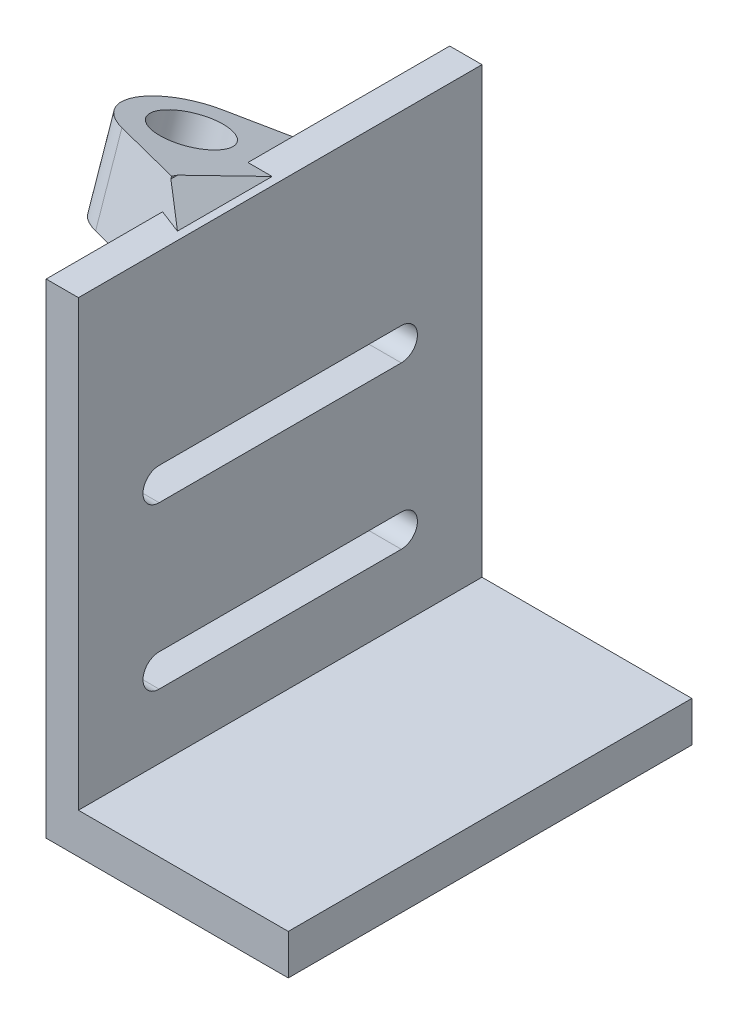
ISO-10303-21;
HEADER;
FILE_DESCRIPTION(('STEP AP214'),'2;1');
FILE_NAME('part.step','',(''),(''),'','','');
FILE_SCHEMA(('AUTOMOTIVE_DESIGN { 1 0 10303 214 1 1 1 1 }'));
ENDSEC;
DATA;
#1=APPLICATION_CONTEXT('core data for automotive mechanical design processes');
#2=APPLICATION_PROTOCOL_DEFINITION('international standard','automotive_design',2000,#1);
#3=PRODUCT_CONTEXT('',#1,'mechanical');
#4=PRODUCT('Part','Part','',(#3));
#5=PRODUCT_RELATED_PRODUCT_CATEGORY('part','',(#4));
#6=PRODUCT_DEFINITION_FORMATION('','',#4);
#7=PRODUCT_DEFINITION_CONTEXT('part definition',#1,'design');
#8=PRODUCT_DEFINITION('design','',#6,#7);
#9=PRODUCT_DEFINITION_SHAPE('','',#8);
#10=(LENGTH_UNIT() NAMED_UNIT(*) SI_UNIT(.MILLI.,.METRE.));
#11=(NAMED_UNIT(*) PLANE_ANGLE_UNIT() SI_UNIT($,.RADIAN.));
#12=(NAMED_UNIT(*) SI_UNIT($,.STERADIAN.) SOLID_ANGLE_UNIT());
#13=UNCERTAINTY_MEASURE_WITH_UNIT(LENGTH_MEASURE(1.E-05),#10,'distance_accuracy_value','');
#14=(GEOMETRIC_REPRESENTATION_CONTEXT(3) GLOBAL_UNCERTAINTY_ASSIGNED_CONTEXT((#13)) GLOBAL_UNIT_ASSIGNED_CONTEXT((#10,
#11,#12)) REPRESENTATION_CONTEXT('',''));
#15=CARTESIAN_POINT('',(0.,0.,0.));
#16=DIRECTION('',(0.,0.,1.));
#17=DIRECTION('',(1.,0.,0.));
#18=AXIS2_PLACEMENT_3D('',#15,#16,#17);
#19=CARTESIAN_POINT('',(0.,60.,50.));
#20=DIRECTION('',(1.,0.,0.));
#21=DIRECTION('',(0.,1.,0.));
#22=AXIS2_PLACEMENT_3D('',#19,#20,#21);
#23=PLANE('',#22);
#24=DIRECTION('',(0.,0.,1.));
#25=VECTOR('',#24,1.);
#26=CARTESIAN_POINT('',(0.,17.,50.));
#27=LINE('',#26,#25);
#28=CARTESIAN_POINT('',(0.,17.,10.));
#29=VERTEX_POINT('',#28);
#30=CARTESIAN_POINT('',(0.,17.,40.));
#31=VERTEX_POINT('',#30);
#32=EDGE_CURVE('E292',#29,#31,#27,.T.);
#33=ORIENTED_EDGE('',*,*,#32,.T.);
#34=CARTESIAN_POINT('',(0.,15.,40.));
#35=DIRECTION('',(1.,0.,0.));
#36=DIRECTION('',(0.,1.,0.));
#37=AXIS2_PLACEMENT_3D('',#34,#35,#36);
#38=CIRCLE('',#37,2.00000000000001);
#39=CARTESIAN_POINT('',(0.,13.,40.));
#40=VERTEX_POINT('',#39);
#41=EDGE_CURVE('E295',#31,#40,#38,.T.);
#42=ORIENTED_EDGE('',*,*,#41,.T.);
#43=DIRECTION('',(0.,0.,-1.));
#44=VECTOR('',#43,1.);
#45=CARTESIAN_POINT('',(0.,13.,50.));
#46=LINE('',#45,#44);
#47=CARTESIAN_POINT('',(0.,13.,10.));
#48=VERTEX_POINT('',#47);
#49=EDGE_CURVE('E280',#40,#48,#46,.T.);
#50=ORIENTED_EDGE('',*,*,#49,.T.);
#51=CARTESIAN_POINT('',(0.,15.,10.));
#52=DIRECTION('',(1.,0.,0.));
#53=DIRECTION('',(0.,1.,0.));
#54=AXIS2_PLACEMENT_3D('',#51,#52,#53);
#55=CIRCLE('',#54,2.00000000000001);
#56=EDGE_CURVE('E289',#48,#29,#55,.T.);
#57=ORIENTED_EDGE('',*,*,#56,.T.);
#58=EDGE_LOOP('',(#33,#42,#50,#57));
#59=FACE_BOUND('',#58,.T.);
#60=DIRECTION('',(0.,0.,1.));
#61=VECTOR('',#60,1.);
#62=CARTESIAN_POINT('',(0.,37.,50.));
#63=LINE('',#62,#61);
#64=CARTESIAN_POINT('',(0.,37.,10.));
#65=VERTEX_POINT('',#64);
#66=CARTESIAN_POINT('',(0.,37.,40.));
#67=VERTEX_POINT('',#66);
#68=EDGE_CURVE('E324',#65,#67,#63,.T.);
#69=ORIENTED_EDGE('',*,*,#68,.T.);
#70=CARTESIAN_POINT('',(0.,35.,40.));
#71=DIRECTION('',(1.,0.,0.));
#72=DIRECTION('',(0.,1.,0.));
#73=AXIS2_PLACEMENT_3D('',#70,#71,#72);
#74=CIRCLE('',#73,2.00000000000002);
#75=CARTESIAN_POINT('',(0.,33.,40.));
#76=VERTEX_POINT('',#75);
#77=EDGE_CURVE('E327',#67,#76,#74,.T.);
#78=ORIENTED_EDGE('',*,*,#77,.T.);
#79=DIRECTION('',(0.,0.,-1.));
#80=VECTOR('',#79,1.);
#81=CARTESIAN_POINT('',(0.,33.,50.));
#82=LINE('',#81,#80);
#83=CARTESIAN_POINT('',(0.,33.,10.));
#84=VERTEX_POINT('',#83);
#85=EDGE_CURVE('E312',#76,#84,#82,.T.);
#86=ORIENTED_EDGE('',*,*,#85,.T.);
#87=CARTESIAN_POINT('',(0.,35.,10.));
#88=DIRECTION('',(1.,0.,0.));
#89=DIRECTION('',(0.,1.,0.));
#90=AXIS2_PLACEMENT_3D('',#87,#88,#89);
#91=CIRCLE('',#90,2.00000000000002);
#92=EDGE_CURVE('E321',#84,#65,#91,.T.);
#93=ORIENTED_EDGE('',*,*,#92,.T.);
#94=EDGE_LOOP('',(#69,#78,#86,#93));
#95=FACE_BOUND('',#94,.T.);
#96=DIRECTION('',(0.,-0.945518575599318,0.325568154457154));
#97=VECTOR('',#96,1.);
#98=CARTESIAN_POINT('',(0.,56.7443184554284,15.5448142440068));
#99=LINE('',#98,#97);
#100=CARTESIAN_POINT('',(0.,56.7443184554285,15.5448142440068));
#101=VERTEX_POINT('',#100);
#102=CARTESIAN_POINT('',(0.,47.2891326994353,18.8004957885784));
#103=VERTEX_POINT('',#102);
#104=EDGE_CURVE('E223',#101,#103,#99,.T.);
#105=ORIENTED_EDGE('',*,*,#104,.F.);
#106=DIRECTION('',(0.,0.325568154457154,0.945518575599318));
#107=VECTOR('',#106,1.);
#108=CARTESIAN_POINT('',(0.,63.2556815445715,34.4551857559932));
#109=LINE('',#108,#107);
#110=CARTESIAN_POINT('',(0.,60.,25.));
#111=VERTEX_POINT('',#110);
#112=EDGE_CURVE('E179',#101,#111,#109,.T.);
#113=ORIENTED_EDGE('',*,*,#112,.T.);
#114=DIRECTION('',(0.,0.,-1.));
#115=VECTOR('',#114,1.);
#116=CARTESIAN_POINT('',(0.,60.,50.));
#117=LINE('',#116,#115);
#118=CARTESIAN_POINT('',(0.,60.,0.));
#119=VERTEX_POINT('',#118);
#120=EDGE_CURVE('E253',#111,#119,#117,.T.);
#121=ORIENTED_EDGE('',*,*,#120,.T.);
#122=DIRECTION('',(0.,-1.,0.));
#123=VECTOR('',#122,1.);
#124=CARTESIAN_POINT('',(0.,60.,0.));
#125=LINE('',#124,#123);
#126=CARTESIAN_POINT('',(0.,0.,0.));
#127=VERTEX_POINT('',#126);
#128=EDGE_CURVE('E330',#119,#127,#125,.T.);
#129=ORIENTED_EDGE('',*,*,#128,.T.);
#130=DIRECTION('',(0.,0.,-1.));
#131=VECTOR('',#130,1.);
#132=CARTESIAN_POINT('',(0.,0.,50.));
#133=LINE('',#132,#131);
#134=CARTESIAN_POINT('',(0.,0.,50.));
#135=VERTEX_POINT('',#134);
#136=EDGE_CURVE('E370',#135,#127,#133,.T.);
#137=ORIENTED_EDGE('',*,*,#136,.F.);
#138=DIRECTION('',(0.,-1.,0.));
#139=VECTOR('',#138,1.);
#140=CARTESIAN_POINT('',(0.,60.,50.));
#141=LINE('',#140,#139);
#142=CARTESIAN_POINT('',(0.,60.,50.));
#143=VERTEX_POINT('',#142);
#144=EDGE_CURVE('E331',#143,#135,#141,.T.);
#145=ORIENTED_EDGE('',*,*,#144,.F.);
#146=CARTESIAN_POINT('',(0.,60.,35.5762068118667));
#147=VERTEX_POINT('',#146);
#148=EDGE_CURVE('E356',#143,#147,#117,.T.);
#149=ORIENTED_EDGE('',*,*,#148,.T.);
#150=DIRECTION('',(0.,-0.945518575599318,0.325568154457154));
#151=VECTOR('',#150,1.);
#152=CARTESIAN_POINT('',(0.,63.2556815445715,34.4551857559932));
#153=LINE('',#152,#151);
#154=CARTESIAN_POINT('',(0.,53.8004957885784,37.7108673005647));
#155=VERTEX_POINT('',#154);
#156=EDGE_CURVE('E237',#147,#155,#153,.T.);
#157=ORIENTED_EDGE('',*,*,#156,.T.);
#158=DIRECTION('',(0.,0.325568154457154,0.945518575599318));
#159=VECTOR('',#158,1.);
#160=CARTESIAN_POINT('',(0.,53.8004957885784,37.7108673005647));
#161=LINE('',#160,#159);
#162=EDGE_CURVE('E226',#103,#155,#161,.T.);
#163=ORIENTED_EDGE('',*,*,#162,.F.);
#164=EDGE_LOOP('',(#105,#113,#121,#129,#137,#145,#149,#157,#163));
#165=FACE_BOUND('',#164,.T.);
#166=ADVANCED_FACE('F34',(#59,#95,#165),#23,.F.);
#167=CARTESIAN_POINT('',(0.,0.,50.));
#168=DIRECTION('',(0.,1.,0.));
#169=DIRECTION('',(0.,0.,1.));
#170=AXIS2_PLACEMENT_3D('',#167,#168,#169);
#171=PLANE('',#170);
#172=DIRECTION('',(1.,0.,0.));
#173=VECTOR('',#172,1.);
#174=CARTESIAN_POINT('',(0.,0.,0.));
#175=LINE('',#174,#173);
#176=CARTESIAN_POINT('',(30.,0.,0.));
#177=VERTEX_POINT('',#176);
#178=EDGE_CURVE('E347',#127,#177,#175,.T.);
#179=ORIENTED_EDGE('',*,*,#178,.T.);
#180=DIRECTION('',(0.,0.,-1.));
#181=VECTOR('',#180,1.);
#182=CARTESIAN_POINT('',(30.,0.,50.));
#183=LINE('',#182,#181);
#184=CARTESIAN_POINT('',(30.,0.,50.));
#185=VERTEX_POINT('',#184);
#186=EDGE_CURVE('E368',#185,#177,#183,.T.);
#187=ORIENTED_EDGE('',*,*,#186,.F.);
#188=DIRECTION('',(1.,0.,0.));
#189=VECTOR('',#188,1.);
#190=CARTESIAN_POINT('',(0.,0.,50.));
#191=LINE('',#190,#189);
#192=EDGE_CURVE('E334',#135,#185,#191,.T.);
#193=ORIENTED_EDGE('',*,*,#192,.F.);
#194=ORIENTED_EDGE('',*,*,#136,.T.);
#195=EDGE_LOOP('',(#179,#187,#193,#194));
#196=FACE_BOUND('',#195,.T.);
#197=ADVANCED_FACE('F412',(#196),#171,.F.);
#198=CARTESIAN_POINT('',(30.,0.,50.));
#199=DIRECTION('',(-1.,0.,0.));
#200=DIRECTION('',(0.,0.,1.));
#201=AXIS2_PLACEMENT_3D('',#198,#199,#200);
#202=PLANE('',#201);
#203=DIRECTION('',(0.,1.,0.));
#204=VECTOR('',#203,1.);
#205=CARTESIAN_POINT('',(30.,0.,0.));
#206=LINE('',#205,#204);
#207=CARTESIAN_POINT('',(30.,5.,0.));
#208=VERTEX_POINT('',#207);
#209=EDGE_CURVE('E349',#177,#208,#206,.T.);
#210=ORIENTED_EDGE('',*,*,#209,.T.);
#211=DIRECTION('',(0.,0.,-1.));
#212=VECTOR('',#211,1.);
#213=CARTESIAN_POINT('',(30.,5.,50.));
#214=LINE('',#213,#212);
#215=CARTESIAN_POINT('',(30.,5.,50.));
#216=VERTEX_POINT('',#215);
#217=EDGE_CURVE('E365',#216,#208,#214,.T.);
#218=ORIENTED_EDGE('',*,*,#217,.F.);
#219=DIRECTION('',(0.,1.,0.));
#220=VECTOR('',#219,1.);
#221=CARTESIAN_POINT('',(30.,0.,50.));
#222=LINE('',#221,#220);
#223=EDGE_CURVE('E337',#185,#216,#222,.T.);
#224=ORIENTED_EDGE('',*,*,#223,.F.);
#225=ORIENTED_EDGE('',*,*,#186,.T.);
#226=EDGE_LOOP('',(#210,#218,#224,#225));
#227=FACE_BOUND('',#226,.T.);
#228=ADVANCED_FACE('F417',(#227),#202,.F.);
#229=CARTESIAN_POINT('',(30.,5.,50.));
#230=DIRECTION('',(0.,-1.,0.));
#231=DIRECTION('',(1.,0.,0.));
#232=AXIS2_PLACEMENT_3D('',#229,#230,#231);
#233=PLANE('',#232);
#234=DIRECTION('',(-1.,0.,0.));
#235=VECTOR('',#234,1.);
#236=CARTESIAN_POINT('',(30.,5.,0.));
#237=LINE('',#236,#235);
#238=CARTESIAN_POINT('',(4.,5.,0.));
#239=VERTEX_POINT('',#238);
#240=EDGE_CURVE('E351',#208,#239,#237,.T.);
#241=ORIENTED_EDGE('',*,*,#240,.T.);
#242=DIRECTION('',(0.,0.,-1.));
#243=VECTOR('',#242,1.);
#244=CARTESIAN_POINT('',(4.,5.,50.));
#245=LINE('',#244,#243);
#246=CARTESIAN_POINT('',(4.,5.,50.));
#247=VERTEX_POINT('',#246);
#248=EDGE_CURVE('E362',#247,#239,#245,.T.);
#249=ORIENTED_EDGE('',*,*,#248,.F.);
#250=DIRECTION('',(-1.,0.,0.));
#251=VECTOR('',#250,1.);
#252=CARTESIAN_POINT('',(30.,5.,50.));
#253=LINE('',#252,#251);
#254=EDGE_CURVE('E339',#216,#247,#253,.T.);
#255=ORIENTED_EDGE('',*,*,#254,.F.);
#256=ORIENTED_EDGE('',*,*,#217,.T.);
#257=EDGE_LOOP('',(#241,#249,#255,#256));
#258=FACE_BOUND('',#257,.T.);
#259=ADVANCED_FACE('F423',(#258),#233,.F.);
#260=CARTESIAN_POINT('',(4.,5.,50.));
#261=DIRECTION('',(-1.,0.,0.));
#262=DIRECTION('',(0.,-1.,0.));
#263=AXIS2_PLACEMENT_3D('',#260,#261,#262);
#264=PLANE('',#263);
#265=DIRECTION('',(0.,0.,-1.));
#266=VECTOR('',#265,1.);
#267=CARTESIAN_POINT('',(4.,13.,40.));
#268=LINE('',#267,#266);
#269=CARTESIAN_POINT('',(4.,13.,40.));
#270=VERTEX_POINT('',#269);
#271=CARTESIAN_POINT('',(4.,13.,10.));
#272=VERTEX_POINT('',#271);
#273=EDGE_CURVE('E199',#270,#272,#268,.T.);
#274=ORIENTED_EDGE('',*,*,#273,.F.);
#275=CARTESIAN_POINT('',(4.,15.,40.));
#276=DIRECTION('',(1.,0.,0.));
#277=DIRECTION('',(0.,1.,0.));
#278=AXIS2_PLACEMENT_3D('',#275,#276,#277);
#279=CIRCLE('',#278,2.00000000000001);
#280=CARTESIAN_POINT('',(4.,17.,40.));
#281=VERTEX_POINT('',#280);
#282=EDGE_CURVE('E197',#281,#270,#279,.T.);
#283=ORIENTED_EDGE('',*,*,#282,.F.);
#284=DIRECTION('',(0.,0.,1.));
#285=VECTOR('',#284,1.);
#286=CARTESIAN_POINT('',(4.,17.,40.));
#287=LINE('',#286,#285);
#288=CARTESIAN_POINT('',(4.,17.,10.));
#289=VERTEX_POINT('',#288);
#290=EDGE_CURVE('E274',#289,#281,#287,.T.);
#291=ORIENTED_EDGE('',*,*,#290,.F.);
#292=CARTESIAN_POINT('',(4.,15.,10.));
#293=DIRECTION('',(1.,0.,0.));
#294=DIRECTION('',(0.,1.,0.));
#295=AXIS2_PLACEMENT_3D('',#292,#293,#294);
#296=CIRCLE('',#295,2.00000000000001);
#297=EDGE_CURVE('E271',#272,#289,#296,.T.);
#298=ORIENTED_EDGE('',*,*,#297,.F.);
#299=EDGE_LOOP('',(#274,#283,#291,#298));
#300=FACE_BOUND('',#299,.T.);
#301=DIRECTION('',(0.,0.,-1.));
#302=VECTOR('',#301,1.);
#303=CARTESIAN_POINT('',(4.,33.,40.));
#304=LINE('',#303,#302);
#305=CARTESIAN_POINT('',(4.,33.,40.));
#306=VERTEX_POINT('',#305);
#307=CARTESIAN_POINT('',(4.,33.,10.));
#308=VERTEX_POINT('',#307);
#309=EDGE_CURVE('E300',#306,#308,#304,.T.);
#310=ORIENTED_EDGE('',*,*,#309,.F.);
#311=CARTESIAN_POINT('',(4.,35.,40.));
#312=DIRECTION('',(1.,0.,0.));
#313=DIRECTION('',(0.,1.,0.));
#314=AXIS2_PLACEMENT_3D('',#311,#312,#313);
#315=CIRCLE('',#314,2.00000000000002);
#316=CARTESIAN_POINT('',(4.,37.,40.));
#317=VERTEX_POINT('',#316);
#318=EDGE_CURVE('E298',#317,#306,#315,.T.);
#319=ORIENTED_EDGE('',*,*,#318,.F.);
#320=DIRECTION('',(0.,0.,1.));
#321=VECTOR('',#320,1.);
#322=CARTESIAN_POINT('',(4.,37.,40.));
#323=LINE('',#322,#321);
#324=CARTESIAN_POINT('',(4.,37.,10.));
#325=VERTEX_POINT('',#324);
#326=EDGE_CURVE('E306',#325,#317,#323,.T.);
#327=ORIENTED_EDGE('',*,*,#326,.F.);
#328=CARTESIAN_POINT('',(4.,35.,10.));
#329=DIRECTION('',(1.,0.,0.));
#330=DIRECTION('',(0.,1.,0.));
#331=AXIS2_PLACEMENT_3D('',#328,#329,#330);
#332=CIRCLE('',#331,2.00000000000002);
#333=EDGE_CURVE('E303',#308,#325,#332,.T.);
#334=ORIENTED_EDGE('',*,*,#333,.F.);
#335=EDGE_LOOP('',(#310,#319,#327,#334));
#336=FACE_BOUND('',#335,.T.);
#337=DIRECTION('',(0.,1.,0.));
#338=VECTOR('',#337,1.);
#339=CARTESIAN_POINT('',(4.,5.,0.));
#340=LINE('',#339,#338);
#341=CARTESIAN_POINT('',(4.,60.,0.));
#342=VERTEX_POINT('',#341);
#343=EDGE_CURVE('E353',#239,#342,#340,.T.);
#344=ORIENTED_EDGE('',*,*,#343,.T.);
#345=DIRECTION('',(0.,0.,-1.));
#346=VECTOR('',#345,1.);
#347=CARTESIAN_POINT('',(4.,60.,50.));
#348=LINE('',#347,#346);
#349=CARTESIAN_POINT('',(4.,60.,50.));
#350=VERTEX_POINT('',#349);
#351=EDGE_CURVE('E359',#350,#342,#348,.T.);
#352=ORIENTED_EDGE('',*,*,#351,.F.);
#353=DIRECTION('',(0.,1.,0.));
#354=VECTOR('',#353,1.);
#355=CARTESIAN_POINT('',(4.,5.,50.));
#356=LINE('',#355,#354);
#357=EDGE_CURVE('E341',#247,#350,#356,.T.);
#358=ORIENTED_EDGE('',*,*,#357,.F.);
#359=ORIENTED_EDGE('',*,*,#248,.T.);
#360=EDGE_LOOP('',(#344,#352,#358,#359));
#361=FACE_BOUND('',#360,.T.);
#362=ADVANCED_FACE('F427',(#300,#336,#361),#264,.F.);
#363=CARTESIAN_POINT('',(4.,60.,50.));
#364=DIRECTION('',(0.,-1.,0.));
#365=DIRECTION('',(0.,0.,-1.));
#366=AXIS2_PLACEMENT_3D('',#363,#364,#365);
#367=PLANE('',#366);
#368=ORIENTED_EDGE('',*,*,#120,.F.);
#369=DIRECTION('',(1.,0.,0.));
#370=VECTOR('',#369,1.);
#371=CARTESIAN_POINT('',(-1.38535694471102E-13,60.,25.0000000000001));
#372=LINE('',#371,#370);
#373=CARTESIAN_POINT('',(3.00000000000002,60.,25.0000000000001));
#374=VERTEX_POINT('',#373);
#375=EDGE_CURVE('E49',#111,#374,#372,.T.);
#376=ORIENTED_EDGE('',*,*,#375,.T.);
#377=DIRECTION('',(0.,0.,1.));
#378=VECTOR('',#377,1.);
#379=CARTESIAN_POINT('',(3.00000000000002,60.,50.));
#380=LINE('',#379,#378);
#381=CARTESIAN_POINT('',(3.00000000000002,60.,36.732035127735));
#382=VERTEX_POINT('',#381);
#383=EDGE_CURVE('E245',#374,#382,#380,.T.);
#384=ORIENTED_EDGE('',*,*,#383,.T.);
#385=DIRECTION('',(-0.933138877598145,0.,-0.359516112455163));
#386=VECTOR('',#385,1.);
#387=CARTESIAN_POINT('',(8.32186460952331,60.,38.7824223973698));
#388=LINE('',#387,#386);
#389=EDGE_CURVE('E243',#382,#147,#388,.T.);
#390=ORIENTED_EDGE('',*,*,#389,.T.);
#391=ORIENTED_EDGE('',*,*,#148,.F.);
#392=DIRECTION('',(-1.,0.,0.));
#393=VECTOR('',#392,1.);
#394=CARTESIAN_POINT('',(4.,60.,50.));
#395=LINE('',#394,#393);
#396=EDGE_CURVE('E343',#350,#143,#395,.T.);
#397=ORIENTED_EDGE('',*,*,#396,.F.);
#398=ORIENTED_EDGE('',*,*,#351,.T.);
#399=DIRECTION('',(-1.,0.,0.));
#400=VECTOR('',#399,1.);
#401=CARTESIAN_POINT('',(4.,60.,0.));
#402=LINE('',#401,#400);
#403=EDGE_CURVE('E335',#342,#119,#402,.T.);
#404=ORIENTED_EDGE('',*,*,#403,.T.);
#405=EDGE_LOOP('',(#368,#376,#384,#390,#391,#397,#398,#404));
#406=FACE_BOUND('',#405,.T.);
#407=ADVANCED_FACE('F250',(#406),#367,.F.);
#408=CARTESIAN_POINT('',(0.,0.,50.));
#409=DIRECTION('',(0.,0.,1.));
#410=DIRECTION('',(1.,0.,0.));
#411=AXIS2_PLACEMENT_3D('',#408,#409,#410);
#412=PLANE('',#411);
#413=ORIENTED_EDGE('',*,*,#144,.T.);
#414=ORIENTED_EDGE('',*,*,#192,.T.);
#415=ORIENTED_EDGE('',*,*,#223,.T.);
#416=ORIENTED_EDGE('',*,*,#254,.T.);
#417=ORIENTED_EDGE('',*,*,#357,.T.);
#418=ORIENTED_EDGE('',*,*,#396,.T.);
#419=EDGE_LOOP('',(#413,#414,#415,#416,#417,#418));
#420=FACE_BOUND('',#419,.T.);
#421=ADVANCED_FACE('F434',(#420),#412,.T.);
#422=CARTESIAN_POINT('',(0.,0.,0.));
#423=DIRECTION('',(0.,0.,1.));
#424=DIRECTION('',(1.,0.,0.));
#425=AXIS2_PLACEMENT_3D('',#422,#423,#424);
#426=PLANE('',#425);
#427=ORIENTED_EDGE('',*,*,#128,.F.);
#428=ORIENTED_EDGE('',*,*,#403,.F.);
#429=ORIENTED_EDGE('',*,*,#343,.F.);
#430=ORIENTED_EDGE('',*,*,#240,.F.);
#431=ORIENTED_EDGE('',*,*,#209,.F.);
#432=ORIENTED_EDGE('',*,*,#178,.F.);
#433=EDGE_LOOP('',(#427,#428,#429,#430,#431,#432));
#434=FACE_BOUND('',#433,.T.);
#435=ADVANCED_FACE('F435',(#434),#426,.F.);
#436=CARTESIAN_POINT('',(-46.,35.,40.));
#437=DIRECTION('',(1.,0.,0.));
#438=DIRECTION('',(0.,1.,0.));
#439=AXIS2_PLACEMENT_3D('',#436,#437,#438);
#440=CYLINDRICAL_SURFACE('',#439,2.00000000000002);
#441=DIRECTION('',(1.,0.,0.));
#442=VECTOR('',#441,1.);
#443=CARTESIAN_POINT('',(-46.,37.,40.));
#444=LINE('',#443,#442);
#445=EDGE_CURVE('E310',#67,#317,#444,.T.);
#446=ORIENTED_EDGE('',*,*,#445,.T.);
#447=ORIENTED_EDGE('',*,*,#318,.T.);
#448=DIRECTION('',(1.,0.,0.));
#449=VECTOR('',#448,1.);
#450=CARTESIAN_POINT('',(-46.,33.,40.));
#451=LINE('',#450,#449);
#452=EDGE_CURVE('E309',#76,#306,#451,.T.);
#453=ORIENTED_EDGE('',*,*,#452,.F.);
#454=ORIENTED_EDGE('',*,*,#77,.F.);
#455=EDGE_LOOP('',(#446,#447,#453,#454));
#456=FACE_BOUND('',#455,.T.);
#457=ADVANCED_FACE('F438',(#456),#440,.F.);
#458=CARTESIAN_POINT('',(-46.,37.,40.));
#459=DIRECTION('',(0.,1.,0.));
#460=DIRECTION('',(0.,0.,1.));
#461=AXIS2_PLACEMENT_3D('',#458,#459,#460);
#462=PLANE('',#461);
#463=DIRECTION('',(1.,0.,0.));
#464=VECTOR('',#463,1.);
#465=CARTESIAN_POINT('',(-46.,37.,10.));
#466=LINE('',#465,#464);
#467=EDGE_CURVE('E313',#65,#325,#466,.T.);
#468=ORIENTED_EDGE('',*,*,#467,.T.);
#469=ORIENTED_EDGE('',*,*,#326,.T.);
#470=ORIENTED_EDGE('',*,*,#445,.F.);
#471=ORIENTED_EDGE('',*,*,#68,.F.);
#472=EDGE_LOOP('',(#468,#469,#470,#471));
#473=FACE_BOUND('',#472,.T.);
#474=ADVANCED_FACE('F445',(#473),#462,.F.);
#475=CARTESIAN_POINT('',(-46.,35.,10.));
#476=DIRECTION('',(1.,0.,0.));
#477=DIRECTION('',(0.,1.,0.));
#478=AXIS2_PLACEMENT_3D('',#475,#476,#477);
#479=CYLINDRICAL_SURFACE('',#478,2.00000000000002);
#480=DIRECTION('',(1.,0.,0.));
#481=VECTOR('',#480,1.);
#482=CARTESIAN_POINT('',(-46.,33.,10.));
#483=LINE('',#482,#481);
#484=EDGE_CURVE('E315',#84,#308,#483,.T.);
#485=ORIENTED_EDGE('',*,*,#484,.T.);
#486=ORIENTED_EDGE('',*,*,#333,.T.);
#487=ORIENTED_EDGE('',*,*,#467,.F.);
#488=ORIENTED_EDGE('',*,*,#92,.F.);
#489=EDGE_LOOP('',(#485,#486,#487,#488));
#490=FACE_BOUND('',#489,.T.);
#491=ADVANCED_FACE('F451',(#490),#479,.F.);
#492=CARTESIAN_POINT('',(-46.,33.,40.));
#493=DIRECTION('',(0.,-1.,0.));
#494=DIRECTION('',(0.,0.,-1.));
#495=AXIS2_PLACEMENT_3D('',#492,#493,#494);
#496=PLANE('',#495);
#497=ORIENTED_EDGE('',*,*,#452,.T.);
#498=ORIENTED_EDGE('',*,*,#309,.T.);
#499=ORIENTED_EDGE('',*,*,#484,.F.);
#500=ORIENTED_EDGE('',*,*,#85,.F.);
#501=EDGE_LOOP('',(#497,#498,#499,#500));
#502=FACE_BOUND('',#501,.T.);
#503=ADVANCED_FACE('F447',(#502),#496,.F.);
#504=CARTESIAN_POINT('',(-46.,15.,40.));
#505=DIRECTION('',(1.,0.,0.));
#506=DIRECTION('',(0.,1.,0.));
#507=AXIS2_PLACEMENT_3D('',#504,#505,#506);
#508=CYLINDRICAL_SURFACE('',#507,2.00000000000001);
#509=DIRECTION('',(1.,0.,0.));
#510=VECTOR('',#509,1.);
#511=CARTESIAN_POINT('',(-46.,17.,40.));
#512=LINE('',#511,#510);
#513=EDGE_CURVE('E278',#31,#281,#512,.T.);
#514=ORIENTED_EDGE('',*,*,#513,.T.);
#515=ORIENTED_EDGE('',*,*,#282,.T.);
#516=DIRECTION('',(1.,0.,0.));
#517=VECTOR('',#516,1.);
#518=CARTESIAN_POINT('',(-46.,13.,40.));
#519=LINE('',#518,#517);
#520=EDGE_CURVE('E277',#40,#270,#519,.T.);
#521=ORIENTED_EDGE('',*,*,#520,.F.);
#522=ORIENTED_EDGE('',*,*,#41,.F.);
#523=EDGE_LOOP('',(#514,#515,#521,#522));
#524=FACE_BOUND('',#523,.T.);
#525=ADVANCED_FACE('F450',(#524),#508,.F.);
#526=CARTESIAN_POINT('',(-46.,17.,40.));
#527=DIRECTION('',(0.,1.,0.));
#528=DIRECTION('',(0.,0.,1.));
#529=AXIS2_PLACEMENT_3D('',#526,#527,#528);
#530=PLANE('',#529);
#531=DIRECTION('',(1.,0.,0.));
#532=VECTOR('',#531,1.);
#533=CARTESIAN_POINT('',(-46.,17.,10.));
#534=LINE('',#533,#532);
#535=EDGE_CURVE('E281',#29,#289,#534,.T.);
#536=ORIENTED_EDGE('',*,*,#535,.T.);
#537=ORIENTED_EDGE('',*,*,#290,.T.);
#538=ORIENTED_EDGE('',*,*,#513,.F.);
#539=ORIENTED_EDGE('',*,*,#32,.F.);
#540=EDGE_LOOP('',(#536,#537,#538,#539));
#541=FACE_BOUND('',#540,.T.);
#542=ADVANCED_FACE('F460',(#541),#530,.F.);
#543=CARTESIAN_POINT('',(-46.,15.,10.));
#544=DIRECTION('',(1.,0.,0.));
#545=DIRECTION('',(0.,1.,0.));
#546=AXIS2_PLACEMENT_3D('',#543,#544,#545);
#547=CYLINDRICAL_SURFACE('',#546,2.00000000000001);
#548=DIRECTION('',(1.,0.,0.));
#549=VECTOR('',#548,1.);
#550=CARTESIAN_POINT('',(-46.,13.,10.));
#551=LINE('',#550,#549);
#552=EDGE_CURVE('E283',#48,#272,#551,.T.);
#553=ORIENTED_EDGE('',*,*,#552,.T.);
#554=ORIENTED_EDGE('',*,*,#297,.T.);
#555=ORIENTED_EDGE('',*,*,#535,.F.);
#556=ORIENTED_EDGE('',*,*,#56,.F.);
#557=EDGE_LOOP('',(#553,#554,#555,#556));
#558=FACE_BOUND('',#557,.T.);
#559=ADVANCED_FACE('F407',(#558),#547,.F.);
#560=CARTESIAN_POINT('',(-46.,13.,40.));
#561=DIRECTION('',(0.,-1.,0.));
#562=DIRECTION('',(0.,0.,-1.));
#563=AXIS2_PLACEMENT_3D('',#560,#561,#562);
#564=PLANE('',#563);
#565=ORIENTED_EDGE('',*,*,#520,.T.);
#566=ORIENTED_EDGE('',*,*,#273,.T.);
#567=ORIENTED_EDGE('',*,*,#552,.F.);
#568=ORIENTED_EDGE('',*,*,#49,.F.);
#569=EDGE_LOOP('',(#565,#566,#567,#568));
#570=FACE_BOUND('',#569,.T.);
#571=ADVANCED_FACE('F400',(#570),#564,.F.);
#572=CARTESIAN_POINT('',(0.,36.4893684106378,-12.5642971352822));
#573=DIRECTION('',(0.,-0.945518575599317,0.325568154457156));
#574=DIRECTION('',(0.,-0.325568154457156,-0.945518575599317));
#575=AXIS2_PLACEMENT_3D('',#572,#573,#574);
#576=PLANE('',#575);
#577=CARTESIAN_POINT('',(-7.00000000000001,50.5448142440068,28.2556815445715));
#578=DIRECTION('',(0.,-0.945518575599318,0.325568154457155));
#579=DIRECTION('',(0.,-0.325568154457155,-0.945518575599318));
#580=AXIS2_PLACEMENT_3D('',#577,#578,#579);
#581=CIRCLE('',#580,4.15);
#582=CARTESIAN_POINT('',(-7.00000000000001,49.1937064030096,24.3317794558344));
#583=VERTEX_POINT('',#582);
#584=EDGE_CURVE('E215',#583,#583,#581,.T.);
#585=ORIENTED_EDGE('',*,*,#584,.F.);
#586=EDGE_LOOP('',(#585));
#587=FACE_BOUND('',#586,.T.);
#588=DIRECTION('',(-0.939597315436242,-0.111436079713523,-0.323633874869565));
#589=VECTOR('',#588,1.);
#590=CARTESIAN_POINT('',(-9.39597315436243,52.6861349914431,34.4745285518691));
#591=LINE('',#590,#589);
#592=CARTESIAN_POINT('',(-9.39597315436243,52.6861349914431,34.4745285518691));
#593=VERTEX_POINT('',#592);
#594=EDGE_CURVE('E212',#155,#593,#591,.T.);
#595=ORIENTED_EDGE('',*,*,#594,.T.);
#596=CARTESIAN_POINT('',(-7.00000000000001,50.5448142440068,28.2556815445715));
#597=DIRECTION('',(0.,-0.945518575599317,0.325568154457156));
#598=DIRECTION('',(0.,-0.325568154457156,-0.945518575599317));
#599=AXIS2_PLACEMENT_3D('',#596,#597,#598);
#600=CIRCLE('',#599,7.);
#601=CARTESIAN_POINT('',(-9.39597315436242,48.4034934965705,22.036834537274));
#602=VERTEX_POINT('',#601);
#603=EDGE_CURVE('E183',#593,#602,#600,.T.);
#604=ORIENTED_EDGE('',*,*,#603,.T.);
#605=DIRECTION('',(0.939597315436242,-0.111436079713522,-0.323633874869565));
#606=VECTOR('',#605,1.);
#607=CARTESIAN_POINT('',(0.,47.2891326994353,18.8004957885784));
#608=LINE('',#607,#606);
#609=EDGE_CURVE('E189',#602,#103,#608,.T.);
#610=ORIENTED_EDGE('',*,*,#609,.T.);
#611=ORIENTED_EDGE('',*,*,#162,.T.);
#612=EDGE_LOOP('',(#595,#604,#610,#611));
#613=FACE_BOUND('',#612,.T.);
#614=ADVANCED_FACE('F381',(#587,#613),#576,.T.);
#615=CARTESIAN_POINT('',(0.,45.944554166631,-15.8199786798537));
#616=DIRECTION('',(0.,-0.945518575599317,0.325568154457156));
#617=DIRECTION('',(0.,-0.325568154457156,-0.945518575599317));
#618=AXIS2_PLACEMENT_3D('',#615,#616,#617);
#619=PLANE('',#618);
#620=CARTESIAN_POINT('',(-7.00000000000001,60.,25.));
#621=DIRECTION('',(0.,-0.945518575599318,0.325568154457155));
#622=DIRECTION('',(0.,-0.325568154457155,-0.945518575599318));
#623=AXIS2_PLACEMENT_3D('',#620,#621,#622);
#624=CIRCLE('',#623,4.15);
#625=CARTESIAN_POINT('',(-7.00000000000001,58.6488921590028,21.0760979112628));
#626=VERTEX_POINT('',#625);
#627=EDGE_CURVE('E388',#626,#626,#624,.T.);
#628=ORIENTED_EDGE('',*,*,#627,.T.);
#629=EDGE_LOOP('',(#628));
#630=FACE_BOUND('',#629,.T.);
#631=DIRECTION('',(-0.939597315436242,-0.111436079713523,-0.323633874869565));
#632=VECTOR('',#631,1.);
#633=CARTESIAN_POINT('',(-9.39597315436243,62.1413207474363,31.2188470072975));
#634=LINE('',#633,#632);
#635=CARTESIAN_POINT('',(0.,63.2556815445715,34.4551857559932));
#636=VERTEX_POINT('',#635);
#637=CARTESIAN_POINT('',(-9.39597315436243,62.1413207474363,31.2188470072975));
#638=VERTEX_POINT('',#637);
#639=EDGE_CURVE('E263',#636,#638,#634,.T.);
#640=ORIENTED_EDGE('',*,*,#639,.F.);
#641=CARTESIAN_POINT('',(0.,63.0000000000001,33.7126326330277));
#642=VERTEX_POINT('',#641);
#643=EDGE_CURVE('E225',#642,#636,#109,.T.);
#644=ORIENTED_EDGE('',*,*,#643,.F.);
#645=DIRECTION('',(0.309574663715492,-0.309574663715496,-0.89907010581538));
#646=VECTOR('',#645,1.);
#647=CARTESIAN_POINT('',(15.4209120692412,47.5790879307586,-11.0729479421457));
#648=LINE('',#647,#646);
#649=EDGE_CURVE('E42',#642,#374,#648,.T.);
#650=ORIENTED_EDGE('',*,*,#649,.T.);
#651=ORIENTED_EDGE('',*,*,#375,.F.);
#652=ORIENTED_EDGE('',*,*,#112,.F.);
#653=DIRECTION('',(0.939597315436242,-0.111436079713522,-0.323633874869565));
#654=VECTOR('',#653,1.);
#655=CARTESIAN_POINT('',(0.,56.7443184554284,15.5448142440068));
#656=LINE('',#655,#654);
#657=CARTESIAN_POINT('',(-9.39597315436242,57.8586792525637,18.7811529927025));
#658=VERTEX_POINT('',#657);
#659=EDGE_CURVE('E171',#658,#101,#656,.T.);
#660=ORIENTED_EDGE('',*,*,#659,.F.);
#661=CARTESIAN_POINT('',(-7.00000000000001,60.,25.));
#662=DIRECTION('',(0.,-0.945518575599317,0.325568154457156));
#663=DIRECTION('',(0.,-0.325568154457156,-0.945518575599317));
#664=AXIS2_PLACEMENT_3D('',#661,#662,#663);
#665=CIRCLE('',#664,7.);
#666=EDGE_CURVE('E176',#638,#658,#665,.T.);
#667=ORIENTED_EDGE('',*,*,#666,.F.);
#668=EDGE_LOOP('',(#640,#644,#650,#651,#652,#660,#667));
#669=FACE_BOUND('',#668,.T.);
#670=ADVANCED_FACE('F174',(#630,#669),#619,.F.);
#671=CARTESIAN_POINT('',(-9.39597315436243,62.1413207474363,31.2188470072975));
#672=DIRECTION('',(-0.342281879194631,0.305902963919474,0.888406715328218));
#673=DIRECTION('',(0.933138877598145,0.,0.359516112455163));
#674=AXIS2_PLACEMENT_3D('',#671,#672,#673);
#675=PLANE('',#674);
#676=ORIENTED_EDGE('',*,*,#594,.F.);
#677=ORIENTED_EDGE('',*,*,#156,.F.);
#678=ORIENTED_EDGE('',*,*,#389,.F.);
#679=DIRECTION('',(-0.628406359512634,0.628406359512642,-0.45848761667917));
#680=VECTOR('',#679,1.);
#681=CARTESIAN_POINT('',(-0.0253652656617216,63.0253652656618,34.5247173798482));
#682=LINE('',#681,#680);
#683=CARTESIAN_POINT('',(0.,63.0000000000001,34.5432239719977));
#684=VERTEX_POINT('',#683);
#685=EDGE_CURVE('E12',#382,#684,#682,.T.);
#686=ORIENTED_EDGE('',*,*,#685,.T.);
#687=EDGE_CURVE('E214',#636,#684,#153,.T.);
#688=ORIENTED_EDGE('',*,*,#687,.F.);
#689=ORIENTED_EDGE('',*,*,#639,.T.);
#690=DIRECTION('',(0.,-0.945518575599318,0.325568154457154));
#691=VECTOR('',#690,1.);
#692=CARTESIAN_POINT('',(-9.39597315436243,62.1413207474363,31.2188470072975));
#693=LINE('',#692,#691);
#694=EDGE_CURVE('E195',#638,#593,#693,.T.);
#695=ORIENTED_EDGE('',*,*,#694,.T.);
#696=EDGE_LOOP('',(#676,#677,#678,#686,#688,#689,#695));
#697=FACE_BOUND('',#696,.T.);
#698=ADVANCED_FACE('F259',(#697),#675,.T.);
#699=CARTESIAN_POINT('',(0.,63.2556815445715,34.4551857559932));
#700=DIRECTION('',(1.,0.,0.));
#701=DIRECTION('',(0.,1.,0.));
#702=AXIS2_PLACEMENT_3D('',#699,#700,#701);
#703=PLANE('',#702);
#704=ORIENTED_EDGE('',*,*,#687,.T.);
#705=DIRECTION('',(0.,0.,-1.));
#706=VECTOR('',#705,1.);
#707=CARTESIAN_POINT('',(0.,63.0000000000001,34.4551857559932));
#708=LINE('',#707,#706);
#709=EDGE_CURVE('E240',#684,#642,#708,.T.);
#710=ORIENTED_EDGE('',*,*,#709,.T.);
#711=ORIENTED_EDGE('',*,*,#643,.T.);
#712=EDGE_LOOP('',(#704,#710,#711));
#713=FACE_BOUND('',#712,.T.);
#714=ADVANCED_FACE('F262',(#713),#703,.T.);
#715=CARTESIAN_POINT('',(0.,56.7443184554284,15.5448142440068));
#716=DIRECTION('',(-0.342281879194631,-0.305902963919474,-0.888406715328218));
#717=DIRECTION('',(-0.933138877598145,0.,0.359516112455163));
#718=AXIS2_PLACEMENT_3D('',#715,#716,#717);
#719=PLANE('',#718);
#720=ORIENTED_EDGE('',*,*,#609,.F.);
#721=DIRECTION('',(0.,-0.945518575599318,0.325568154457154));
#722=VECTOR('',#721,1.);
#723=CARTESIAN_POINT('',(-9.39597315436242,57.8586792525637,18.7811529927025));
#724=LINE('',#723,#722);
#725=EDGE_CURVE('E184',#658,#602,#724,.T.);
#726=ORIENTED_EDGE('',*,*,#725,.F.);
#727=ORIENTED_EDGE('',*,*,#659,.T.);
#728=ORIENTED_EDGE('',*,*,#104,.T.);
#729=EDGE_LOOP('',(#720,#726,#727,#728));
#730=FACE_BOUND('',#729,.T.);
#731=ADVANCED_FACE('F188',(#730),#719,.T.);
#732=CARTESIAN_POINT('',(-7.00000000000001,60.,25.));
#733=DIRECTION('',(0.,-0.945518575599318,0.325568154457154));
#734=DIRECTION('',(0.,-0.325568154457154,-0.945518575599318));
#735=AXIS2_PLACEMENT_3D('',#732,#733,#734);
#736=CYLINDRICAL_SURFACE('',#735,7.);
#737=ORIENTED_EDGE('',*,*,#603,.F.);
#738=ORIENTED_EDGE('',*,*,#694,.F.);
#739=ORIENTED_EDGE('',*,*,#666,.T.);
#740=ORIENTED_EDGE('',*,*,#725,.T.);
#741=EDGE_LOOP('',(#737,#738,#739,#740));
#742=FACE_BOUND('',#741,.T.);
#743=ADVANCED_FACE('F193',(#742),#736,.T.);
#744=CARTESIAN_POINT('',(-7.00000000000001,60.,25.));
#745=DIRECTION('',(0.,-0.945518575599318,0.325568154457154));
#746=DIRECTION('',(0.,-0.325568154457154,-0.945518575599318));
#747=AXIS2_PLACEMENT_3D('',#744,#745,#746);
#748=CYLINDRICAL_SURFACE('',#747,4.15);
#749=ORIENTED_EDGE('',*,*,#627,.F.);
#750=EDGE_LOOP('',(#749));
#751=FACE_BOUND('',#750,.T.);
#752=ORIENTED_EDGE('',*,*,#584,.T.);
#753=EDGE_LOOP('',(#752));
#754=FACE_BOUND('',#753,.T.);
#755=ADVANCED_FACE('F393',(#751,#754),#748,.F.);
#756=CARTESIAN_POINT('',(0.,63.0000000000001,34.4551857559932));
#757=DIRECTION('',(-0.707106781186552,-0.707106781186543,0.));
#758=DIRECTION('',(0.,0.,-1.));
#759=AXIS2_PLACEMENT_3D('',#756,#757,#758);
#760=PLANE('',#759);
#761=ORIENTED_EDGE('',*,*,#685,.F.);
#762=ORIENTED_EDGE('',*,*,#383,.F.);
#763=ORIENTED_EDGE('',*,*,#649,.F.);
#764=ORIENTED_EDGE('',*,*,#709,.F.);
#765=EDGE_LOOP('',(#761,#762,#763,#764));
#766=FACE_BOUND('',#765,.T.);
#767=ADVANCED_FACE('F36',(#766),#760,.F.);
#768=CLOSED_SHELL('',(#166,#197,#228,#259,#362,#407,#421,#435,#457,#474,#491,#503,#525,#542,
#559,#571,#614,#670,#698,#714,#731,#743,#755,#767));
#769=MANIFOLD_SOLID_BREP('B2',#768);
#770=ADVANCED_BREP_SHAPE_REPRESENTATION('',(#18,#769),#14);
#771=SHAPE_DEFINITION_REPRESENTATION(#9,#770);
ENDSEC;
END-ISO-10303-21;
